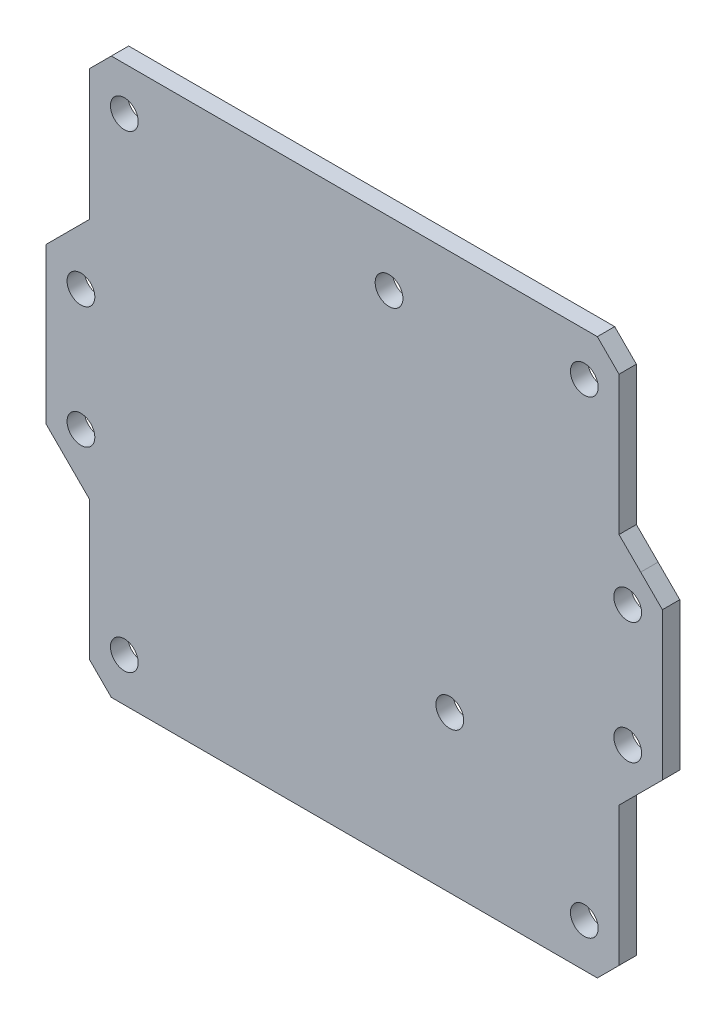
ISO-10303-21;
HEADER;
FILE_DESCRIPTION(('STEP AP214'),'2;1');
FILE_NAME('part.step','',(''),(''),'','','');
FILE_SCHEMA(('AUTOMOTIVE_DESIGN { 1 0 10303 214 1 1 1 1 }'));
ENDSEC;
DATA;
#1=APPLICATION_CONTEXT('core data for automotive mechanical design processes');
#2=APPLICATION_PROTOCOL_DEFINITION('international standard','automotive_design',2000,#1);
#3=PRODUCT_CONTEXT('',#1,'mechanical');
#4=PRODUCT('Part','Part','',(#3));
#5=PRODUCT_RELATED_PRODUCT_CATEGORY('part','',(#4));
#6=PRODUCT_DEFINITION_FORMATION('','',#4);
#7=PRODUCT_DEFINITION_CONTEXT('part definition',#1,'design');
#8=PRODUCT_DEFINITION('design','',#6,#7);
#9=PRODUCT_DEFINITION_SHAPE('','',#8);
#10=(LENGTH_UNIT() NAMED_UNIT(*) SI_UNIT(.MILLI.,.METRE.));
#11=(NAMED_UNIT(*) PLANE_ANGLE_UNIT() SI_UNIT($,.RADIAN.));
#12=(NAMED_UNIT(*) SI_UNIT($,.STERADIAN.) SOLID_ANGLE_UNIT());
#13=UNCERTAINTY_MEASURE_WITH_UNIT(LENGTH_MEASURE(1.E-05),#10,'distance_accuracy_value','');
#14=(GEOMETRIC_REPRESENTATION_CONTEXT(3) GLOBAL_UNCERTAINTY_ASSIGNED_CONTEXT((#13)) GLOBAL_UNIT_ASSIGNED_CONTEXT((#10,
#11,#12)) REPRESENTATION_CONTEXT('',''));
#15=CARTESIAN_POINT('',(0.,0.,0.));
#16=DIRECTION('',(0.,0.,1.));
#17=DIRECTION('',(1.,0.,0.));
#18=AXIS2_PLACEMENT_3D('',#15,#16,#17);
#19=CARTESIAN_POINT('',(0.,0.,2.));
#20=DIRECTION('',(0.,0.,1.));
#21=DIRECTION('',(1.,0.,0.));
#22=AXIS2_PLACEMENT_3D('',#19,#20,#21);
#23=PLANE('',#22);
#24=CARTESIAN_POINT('',(0.,0.,2.));
#25=DIRECTION('',(0.,0.,1.));
#26=DIRECTION('',(1.,0.,0.));
#27=AXIS2_PLACEMENT_3D('',#24,#25,#26);
#28=CIRCLE('',#27,1.6);
#29=CARTESIAN_POINT('',(1.6,0.,2.));
#30=VERTEX_POINT('',#29);
#31=EDGE_CURVE('E252',#30,#30,#28,.T.);
#32=ORIENTED_EDGE('',*,*,#31,.F.);
#33=EDGE_LOOP('',(#32));
#34=FACE_BOUND('',#33,.T.);
#35=CARTESIAN_POINT('',(-7.00000000000001,38.6,2.));
#36=DIRECTION('',(0.,0.,1.));
#37=DIRECTION('',(1.,0.,0.));
#38=AXIS2_PLACEMENT_3D('',#35,#36,#37);
#39=CIRCLE('',#38,1.6);
#40=CARTESIAN_POINT('',(-5.40000000000001,38.6,2.));
#41=VERTEX_POINT('',#40);
#42=EDGE_CURVE('E242',#41,#41,#39,.T.);
#43=ORIENTED_EDGE('',*,*,#42,.F.);
#44=EDGE_LOOP('',(#43));
#45=FACE_BOUND('',#44,.T.);
#46=CARTESIAN_POINT('',(20.5,21.,2.));
#47=DIRECTION('',(0.,0.,1.));
#48=DIRECTION('',(1.,0.,0.));
#49=AXIS2_PLACEMENT_3D('',#46,#47,#48);
#50=CIRCLE('',#49,1.6);
#51=CARTESIAN_POINT('',(22.1,21.,2.));
#52=VERTEX_POINT('',#51);
#53=EDGE_CURVE('E845',#52,#52,#50,.T.);
#54=ORIENTED_EDGE('',*,*,#53,.F.);
#55=EDGE_LOOP('',(#54));
#56=FACE_BOUND('',#55,.T.);
#57=CARTESIAN_POINT('',(20.5,7.,2.));
#58=DIRECTION('',(0.,0.,1.));
#59=DIRECTION('',(1.,0.,0.));
#60=AXIS2_PLACEMENT_3D('',#57,#58,#59);
#61=CIRCLE('',#60,1.6);
#62=CARTESIAN_POINT('',(22.1,7.,2.));
#63=VERTEX_POINT('',#62);
#64=EDGE_CURVE('E833',#63,#63,#61,.T.);
#65=ORIENTED_EDGE('',*,*,#64,.F.);
#66=EDGE_LOOP('',(#65));
#67=FACE_BOUND('',#66,.T.);
#68=CARTESIAN_POINT('',(15.5,41.,2.));
#69=DIRECTION('',(0.,0.,1.));
#70=DIRECTION('',(1.,0.,0.));
#71=AXIS2_PLACEMENT_3D('',#68,#69,#70);
#72=CIRCLE('',#71,1.6);
#73=CARTESIAN_POINT('',(17.1,41.,2.));
#74=VERTEX_POINT('',#73);
#75=EDGE_CURVE('E821',#74,#74,#72,.T.);
#76=ORIENTED_EDGE('',*,*,#75,.F.);
#77=EDGE_LOOP('',(#76));
#78=FACE_BOUND('',#77,.T.);
#79=CARTESIAN_POINT('',(15.5,-13.,2.));
#80=DIRECTION('',(0.,0.,1.));
#81=DIRECTION('',(1.,0.,0.));
#82=AXIS2_PLACEMENT_3D('',#79,#80,#81);
#83=CIRCLE('',#82,1.6);
#84=CARTESIAN_POINT('',(17.1,-13.,2.));
#85=VERTEX_POINT('',#84);
#86=EDGE_CURVE('E808',#85,#85,#83,.T.);
#87=ORIENTED_EDGE('',*,*,#86,.F.);
#88=EDGE_LOOP('',(#87));
#89=FACE_BOUND('',#88,.T.);
#90=DIRECTION('',(1.,0.,0.));
#91=VECTOR('',#90,1.);
#92=CARTESIAN_POINT('',(19.5,-18.,2.));
#93=LINE('',#92,#91);
#94=CARTESIAN_POINT('',(-39.,-18.,2.));
#95=VERTEX_POINT('',#94);
#96=CARTESIAN_POINT('',(17.,-18.,2.));
#97=VERTEX_POINT('',#96);
#98=EDGE_CURVE('E405',#95,#97,#93,.T.);
#99=ORIENTED_EDGE('',*,*,#98,.T.);
#100=DIRECTION('',(-0.707106781186548,-0.707106781186548,0.));
#101=VECTOR('',#100,1.);
#102=CARTESIAN_POINT('',(17.5,-17.5,2.));
#103=LINE('',#102,#101);
#104=CARTESIAN_POINT('',(19.5,-15.5,2.));
#105=VERTEX_POINT('',#104);
#106=EDGE_CURVE('E305',#97,#105,#103,.F.);
#107=ORIENTED_EDGE('',*,*,#106,.T.);
#108=DIRECTION('',(0.,1.,0.));
#109=VECTOR('',#108,1.);
#110=CARTESIAN_POINT('',(19.5,3.,2.));
#111=LINE('',#110,#109);
#112=CARTESIAN_POINT('',(19.5,0.500000000000004,2.));
#113=VERTEX_POINT('',#112);
#114=EDGE_CURVE('E209',#105,#113,#111,.T.);
#115=ORIENTED_EDGE('',*,*,#114,.T.);
#116=DIRECTION('',(-0.707106781186547,-0.707106781186548,0.));
#117=VECTOR('',#116,1.);
#118=CARTESIAN_POINT('',(22.,3.,2.));
#119=LINE('',#118,#117);
#120=CARTESIAN_POINT('',(22.,3.,2.));
#121=VERTEX_POINT('',#120);
#122=EDGE_CURVE('E350',#113,#121,#119,.F.);
#123=ORIENTED_EDGE('',*,*,#122,.T.);
#124=DIRECTION('',(-0.707106781186547,-0.707106781186548,0.));
#125=VECTOR('',#124,1.);
#126=CARTESIAN_POINT('',(9.50000000000001,-9.5,2.));
#127=LINE('',#126,#125);
#128=CARTESIAN_POINT('',(24.5,5.50000000000001,2.));
#129=VERTEX_POINT('',#128);
#130=EDGE_CURVE('E302',#121,#129,#127,.F.);
#131=ORIENTED_EDGE('',*,*,#130,.T.);
#132=DIRECTION('',(0.,1.,0.));
#133=VECTOR('',#132,1.);
#134=CARTESIAN_POINT('',(24.5,25.,2.));
#135=LINE('',#134,#133);
#136=CARTESIAN_POINT('',(24.5,22.5,2.));
#137=VERTEX_POINT('',#136);
#138=EDGE_CURVE('E415',#129,#137,#135,.T.);
#139=ORIENTED_EDGE('',*,*,#138,.T.);
#140=DIRECTION('',(0.707106781186548,-0.707106781186548,0.));
#141=VECTOR('',#140,1.);
#142=CARTESIAN_POINT('',(23.5,23.5,2.));
#143=LINE('',#142,#141);
#144=CARTESIAN_POINT('',(22.,25.,2.));
#145=VERTEX_POINT('',#144);
#146=EDGE_CURVE('E299',#137,#145,#143,.F.);
#147=ORIENTED_EDGE('',*,*,#146,.T.);
#148=DIRECTION('',(0.707106781186548,-0.707106781186548,0.));
#149=VECTOR('',#148,1.);
#150=CARTESIAN_POINT('',(19.5,27.5,2.));
#151=LINE('',#150,#149);
#152=CARTESIAN_POINT('',(19.5,27.5,2.));
#153=VERTEX_POINT('',#152);
#154=EDGE_CURVE('E356',#145,#153,#151,.F.);
#155=ORIENTED_EDGE('',*,*,#154,.T.);
#156=DIRECTION('',(0.,1.,0.));
#157=VECTOR('',#156,1.);
#158=CARTESIAN_POINT('',(19.5,46.,2.));
#159=LINE('',#158,#157);
#160=CARTESIAN_POINT('',(19.5,43.5,2.));
#161=VERTEX_POINT('',#160);
#162=EDGE_CURVE('E419',#153,#161,#159,.T.);
#163=ORIENTED_EDGE('',*,*,#162,.T.);
#164=DIRECTION('',(0.707106781186547,-0.707106781186549,0.));
#165=VECTOR('',#164,1.);
#166=CARTESIAN_POINT('',(31.5,31.4999999999999,2.));
#167=LINE('',#166,#165);
#168=CARTESIAN_POINT('',(17.,46.,2.));
#169=VERTEX_POINT('',#168);
#170=EDGE_CURVE('E296',#161,#169,#167,.F.);
#171=ORIENTED_EDGE('',*,*,#170,.T.);
#172=DIRECTION('',(-1.,0.,0.));
#173=VECTOR('',#172,1.);
#174=CARTESIAN_POINT('',(-33.8800351925215,46.,2.));
#175=LINE('',#174,#173);
#176=CARTESIAN_POINT('',(-39.,46.,2.));
#177=VERTEX_POINT('',#176);
#178=EDGE_CURVE('E423',#169,#177,#175,.T.);
#179=ORIENTED_EDGE('',*,*,#178,.T.);
#180=DIRECTION('',(0.707106781186548,0.707106781186548,0.));
#181=VECTOR('',#180,1.);
#182=CARTESIAN_POINT('',(-42.5,42.5,2.));
#183=LINE('',#182,#181);
#184=CARTESIAN_POINT('',(-41.5,43.5,2.));
#185=VERTEX_POINT('',#184);
#186=EDGE_CURVE('E70',#177,#185,#183,.F.);
#187=ORIENTED_EDGE('',*,*,#186,.T.);
#188=DIRECTION('',(0.,-1.,0.));
#189=VECTOR('',#188,1.);
#190=CARTESIAN_POINT('',(-41.5,46.,2.));
#191=LINE('',#190,#189);
#192=CARTESIAN_POINT('',(-41.5,28.4600726554993,2.));
#193=VERTEX_POINT('',#192);
#194=EDGE_CURVE('E251',#185,#193,#191,.T.);
#195=ORIENTED_EDGE('',*,*,#194,.T.);
#196=DIRECTION('',(0.707106781186548,0.707106781186547,0.));
#197=VECTOR('',#196,1.);
#198=CARTESIAN_POINT('',(-44.,25.9600726554993,2.));
#199=LINE('',#198,#197);
#200=CARTESIAN_POINT('',(-44.,25.9600726554993,2.));
#201=VERTEX_POINT('',#200);
#202=EDGE_CURVE('E13',#193,#201,#199,.F.);
#203=ORIENTED_EDGE('',*,*,#202,.T.);
#204=DIRECTION('',(0.707106781186548,0.707106781186547,0.));
#205=VECTOR('',#204,1.);
#206=CARTESIAN_POINT('',(-34.9800363277496,34.9800363277496,2.));
#207=LINE('',#206,#205);
#208=CARTESIAN_POINT('',(-46.5,23.4600726554993,2.));
#209=VERTEX_POINT('',#208);
#210=EDGE_CURVE('E287',#201,#209,#207,.F.);
#211=ORIENTED_EDGE('',*,*,#210,.T.);
#212=DIRECTION('',(0.,-1.,0.));
#213=VECTOR('',#212,1.);
#214=CARTESIAN_POINT('',(-46.5,25.9600726554993,2.));
#215=LINE('',#214,#213);
#216=CARTESIAN_POINT('',(-46.5,5.50000000000001,2.));
#217=VERTEX_POINT('',#216);
#218=EDGE_CURVE('E241',#209,#217,#215,.T.);
#219=ORIENTED_EDGE('',*,*,#218,.T.);
#220=DIRECTION('',(-0.707106781186548,0.707106781186548,0.));
#221=VECTOR('',#220,1.);
#222=CARTESIAN_POINT('',(-20.5,-20.5,2.));
#223=LINE('',#222,#221);
#224=CARTESIAN_POINT('',(-44.,3.,2.));
#225=VERTEX_POINT('',#224);
#226=EDGE_CURVE('E290',#217,#225,#223,.F.);
#227=ORIENTED_EDGE('',*,*,#226,.T.);
#228=DIRECTION('',(-0.707106781186548,0.707106781186547,0.));
#229=VECTOR('',#228,1.);
#230=CARTESIAN_POINT('',(-41.5,0.500000000000004,2.));
#231=LINE('',#230,#229);
#232=CARTESIAN_POINT('',(-41.5,0.500000000000005,2.));
#233=VERTEX_POINT('',#232);
#234=EDGE_CURVE('E362',#225,#233,#231,.F.);
#235=ORIENTED_EDGE('',*,*,#234,.T.);
#236=DIRECTION('',(0.,-1.,0.));
#237=VECTOR('',#236,1.);
#238=CARTESIAN_POINT('',(-41.5,3.,2.));
#239=LINE('',#238,#237);
#240=CARTESIAN_POINT('',(-41.5,-15.5,2.));
#241=VERTEX_POINT('',#240);
#242=EDGE_CURVE('E401',#233,#241,#239,.T.);
#243=ORIENTED_EDGE('',*,*,#242,.T.);
#244=DIRECTION('',(-0.707106781186548,0.707106781186547,0.));
#245=VECTOR('',#244,1.);
#246=CARTESIAN_POINT('',(-28.5,-28.5,2.));
#247=LINE('',#246,#245);
#248=EDGE_CURVE('E293',#241,#95,#247,.F.);
#249=ORIENTED_EDGE('',*,*,#248,.T.);
#250=EDGE_LOOP('',(#99,#107,#115,#123,#131,#139,#147,#155,#163,#171,#179,#187,#195,#203,#211,
#219,#227,#235,#243,#249));
#251=FACE_BOUND('',#250,.T.);
#252=CARTESIAN_POINT('',(-37.5,41.,2.));
#253=DIRECTION('',(0.,0.,1.));
#254=DIRECTION('',(1.,0.,0.));
#255=AXIS2_PLACEMENT_3D('',#252,#253,#254);
#256=CIRCLE('',#255,1.6);
#257=CARTESIAN_POINT('',(-35.9,41.,2.));
#258=VERTEX_POINT('',#257);
#259=EDGE_CURVE('E430',#258,#258,#256,.T.);
#260=ORIENTED_EDGE('',*,*,#259,.F.);
#261=EDGE_LOOP('',(#260));
#262=FACE_BOUND('',#261,.T.);
#263=CARTESIAN_POINT('',(-37.5,-13.,2.));
#264=DIRECTION('',(0.,0.,1.));
#265=DIRECTION('',(1.,0.,0.));
#266=AXIS2_PLACEMENT_3D('',#263,#264,#265);
#267=CIRCLE('',#266,1.6);
#268=CARTESIAN_POINT('',(-35.9,-13.,2.));
#269=VERTEX_POINT('',#268);
#270=EDGE_CURVE('E816',#269,#269,#267,.T.);
#271=ORIENTED_EDGE('',*,*,#270,.F.);
#272=EDGE_LOOP('',(#271));
#273=FACE_BOUND('',#272,.T.);
#274=CARTESIAN_POINT('',(-42.5,21.,2.));
#275=DIRECTION('',(0.,0.,1.));
#276=DIRECTION('',(1.,0.,0.));
#277=AXIS2_PLACEMENT_3D('',#274,#275,#276);
#278=CIRCLE('',#277,1.6);
#279=CARTESIAN_POINT('',(-40.9,21.,2.));
#280=VERTEX_POINT('',#279);
#281=EDGE_CURVE('E827',#280,#280,#278,.T.);
#282=ORIENTED_EDGE('',*,*,#281,.F.);
#283=EDGE_LOOP('',(#282));
#284=FACE_BOUND('',#283,.T.);
#285=CARTESIAN_POINT('',(-42.5,7.,2.));
#286=DIRECTION('',(0.,0.,1.));
#287=DIRECTION('',(1.,0.,0.));
#288=AXIS2_PLACEMENT_3D('',#285,#286,#287);
#289=CIRCLE('',#288,1.6);
#290=CARTESIAN_POINT('',(-40.9,7.,2.));
#291=VERTEX_POINT('',#290);
#292=EDGE_CURVE('E839',#291,#291,#289,.T.);
#293=ORIENTED_EDGE('',*,*,#292,.F.);
#294=EDGE_LOOP('',(#293));
#295=FACE_BOUND('',#294,.T.);
#296=ADVANCED_FACE('F45',(#34,#45,#56,#67,#78,#89,#251,#262,#273,#284,#295),#23,.T.);
#297=CARTESIAN_POINT('',(0.,0.,0.));
#298=DIRECTION('',(0.,0.,1.));
#299=DIRECTION('',(1.,0.,0.));
#300=AXIS2_PLACEMENT_3D('',#297,#298,#299);
#301=PLANE('',#300);
#302=CARTESIAN_POINT('',(0.,0.,0.));
#303=DIRECTION('',(0.,0.,1.));
#304=DIRECTION('',(1.,0.,0.));
#305=AXIS2_PLACEMENT_3D('',#302,#303,#304);
#306=CIRCLE('',#305,1.6);
#307=CARTESIAN_POINT('',(1.6,0.,0.));
#308=VERTEX_POINT('',#307);
#309=EDGE_CURVE('E246',#308,#308,#306,.T.);
#310=ORIENTED_EDGE('',*,*,#309,.T.);
#311=EDGE_LOOP('',(#310));
#312=FACE_BOUND('',#311,.T.);
#313=CARTESIAN_POINT('',(-7.00000000000001,38.6,0.));
#314=DIRECTION('',(0.,0.,1.));
#315=DIRECTION('',(1.,0.,0.));
#316=AXIS2_PLACEMENT_3D('',#313,#314,#315);
#317=CIRCLE('',#316,1.6);
#318=CARTESIAN_POINT('',(-5.40000000000001,38.6,0.));
#319=VERTEX_POINT('',#318);
#320=EDGE_CURVE('E247',#319,#319,#317,.T.);
#321=ORIENTED_EDGE('',*,*,#320,.T.);
#322=EDGE_LOOP('',(#321));
#323=FACE_BOUND('',#322,.T.);
#324=CARTESIAN_POINT('',(20.5,21.,0.));
#325=DIRECTION('',(0.,0.,1.));
#326=DIRECTION('',(1.,0.,0.));
#327=AXIS2_PLACEMENT_3D('',#324,#325,#326);
#328=CIRCLE('',#327,1.6);
#329=CARTESIAN_POINT('',(22.1,21.,0.));
#330=VERTEX_POINT('',#329);
#331=EDGE_CURVE('E371',#330,#330,#328,.T.);
#332=ORIENTED_EDGE('',*,*,#331,.T.);
#333=EDGE_LOOP('',(#332));
#334=FACE_BOUND('',#333,.T.);
#335=CARTESIAN_POINT('',(-42.5,7.,0.));
#336=DIRECTION('',(0.,0.,1.));
#337=DIRECTION('',(1.,0.,0.));
#338=AXIS2_PLACEMENT_3D('',#335,#336,#337);
#339=CIRCLE('',#338,1.6);
#340=CARTESIAN_POINT('',(-40.9,7.,0.));
#341=VERTEX_POINT('',#340);
#342=EDGE_CURVE('E783',#341,#341,#339,.T.);
#343=ORIENTED_EDGE('',*,*,#342,.T.);
#344=EDGE_LOOP('',(#343));
#345=FACE_BOUND('',#344,.T.);
#346=CARTESIAN_POINT('',(20.5,7.,0.));
#347=DIRECTION('',(0.,0.,1.));
#348=DIRECTION('',(1.,0.,0.));
#349=AXIS2_PLACEMENT_3D('',#346,#347,#348);
#350=CIRCLE('',#349,1.6);
#351=CARTESIAN_POINT('',(22.1,7.,0.));
#352=VERTEX_POINT('',#351);
#353=EDGE_CURVE('E787',#352,#352,#350,.T.);
#354=ORIENTED_EDGE('',*,*,#353,.T.);
#355=EDGE_LOOP('',(#354));
#356=FACE_BOUND('',#355,.T.);
#357=CARTESIAN_POINT('',(-42.5,21.,0.));
#358=DIRECTION('',(0.,0.,1.));
#359=DIRECTION('',(1.,0.,0.));
#360=AXIS2_PLACEMENT_3D('',#357,#358,#359);
#361=CIRCLE('',#360,1.6);
#362=CARTESIAN_POINT('',(-40.9,21.,0.));
#363=VERTEX_POINT('',#362);
#364=EDGE_CURVE('E791',#363,#363,#361,.T.);
#365=ORIENTED_EDGE('',*,*,#364,.T.);
#366=EDGE_LOOP('',(#365));
#367=FACE_BOUND('',#366,.T.);
#368=CARTESIAN_POINT('',(15.5,41.,0.));
#369=DIRECTION('',(0.,0.,1.));
#370=DIRECTION('',(1.,0.,0.));
#371=AXIS2_PLACEMENT_3D('',#368,#369,#370);
#372=CIRCLE('',#371,1.6);
#373=CARTESIAN_POINT('',(17.1,41.,0.));
#374=VERTEX_POINT('',#373);
#375=EDGE_CURVE('E795',#374,#374,#372,.T.);
#376=ORIENTED_EDGE('',*,*,#375,.T.);
#377=EDGE_LOOP('',(#376));
#378=FACE_BOUND('',#377,.T.);
#379=CARTESIAN_POINT('',(-37.5,-13.,0.));
#380=DIRECTION('',(0.,0.,1.));
#381=DIRECTION('',(1.,0.,0.));
#382=AXIS2_PLACEMENT_3D('',#379,#380,#381);
#383=CIRCLE('',#382,1.6);
#384=CARTESIAN_POINT('',(-35.9,-13.,0.));
#385=VERTEX_POINT('',#384);
#386=EDGE_CURVE('E799',#385,#385,#383,.T.);
#387=ORIENTED_EDGE('',*,*,#386,.T.);
#388=EDGE_LOOP('',(#387));
#389=FACE_BOUND('',#388,.T.);
#390=CARTESIAN_POINT('',(15.5,-13.,0.));
#391=DIRECTION('',(0.,0.,1.));
#392=DIRECTION('',(1.,0.,0.));
#393=AXIS2_PLACEMENT_3D('',#390,#391,#392);
#394=CIRCLE('',#393,1.6);
#395=CARTESIAN_POINT('',(17.1,-13.,0.));
#396=VERTEX_POINT('',#395);
#397=EDGE_CURVE('E803',#396,#396,#394,.T.);
#398=ORIENTED_EDGE('',*,*,#397,.T.);
#399=EDGE_LOOP('',(#398));
#400=FACE_BOUND('',#399,.T.);
#401=CARTESIAN_POINT('',(-37.5,41.,0.));
#402=DIRECTION('',(0.,0.,1.));
#403=DIRECTION('',(1.,0.,0.));
#404=AXIS2_PLACEMENT_3D('',#401,#402,#403);
#405=CIRCLE('',#404,1.6);
#406=CARTESIAN_POINT('',(-35.9,41.,0.));
#407=VERTEX_POINT('',#406);
#408=EDGE_CURVE('E408',#407,#407,#405,.T.);
#409=ORIENTED_EDGE('',*,*,#408,.T.);
#410=EDGE_LOOP('',(#409));
#411=FACE_BOUND('',#410,.T.);
#412=DIRECTION('',(0.,1.,0.));
#413=VECTOR('',#412,1.);
#414=CARTESIAN_POINT('',(19.5,3.,0.));
#415=LINE('',#414,#413);
#416=CARTESIAN_POINT('',(19.5,-15.5,0.));
#417=VERTEX_POINT('',#416);
#418=CARTESIAN_POINT('',(19.5,0.500000000000004,0.));
#419=VERTEX_POINT('',#418);
#420=EDGE_CURVE('E206',#417,#419,#415,.T.);
#421=ORIENTED_EDGE('',*,*,#420,.F.);
#422=DIRECTION('',(0.707106781186548,0.707106781186548,0.));
#423=VECTOR('',#422,1.);
#424=CARTESIAN_POINT('',(19.5,-15.5,0.));
#425=LINE('',#424,#423);
#426=CARTESIAN_POINT('',(17.,-18.,0.));
#427=VERTEX_POINT('',#426);
#428=EDGE_CURVE('E187',#417,#427,#425,.F.);
#429=ORIENTED_EDGE('',*,*,#428,.T.);
#430=DIRECTION('',(1.,0.,0.));
#431=VECTOR('',#430,1.);
#432=CARTESIAN_POINT('',(19.5,-18.,0.));
#433=LINE('',#432,#431);
#434=CARTESIAN_POINT('',(-39.,-18.,0.));
#435=VERTEX_POINT('',#434);
#436=EDGE_CURVE('E219',#435,#427,#433,.T.);
#437=ORIENTED_EDGE('',*,*,#436,.F.);
#438=DIRECTION('',(0.707106781186548,-0.707106781186547,0.));
#439=VECTOR('',#438,1.);
#440=CARTESIAN_POINT('',(-39.,-18.,0.));
#441=LINE('',#440,#439);
#442=CARTESIAN_POINT('',(-41.5,-15.5,0.));
#443=VERTEX_POINT('',#442);
#444=EDGE_CURVE('E269',#435,#443,#441,.F.);
#445=ORIENTED_EDGE('',*,*,#444,.T.);
#446=DIRECTION('',(0.,-1.,0.));
#447=VECTOR('',#446,1.);
#448=CARTESIAN_POINT('',(-41.5,-18.,0.));
#449=LINE('',#448,#447);
#450=CARTESIAN_POINT('',(-41.5,0.500000000000004,0.));
#451=VERTEX_POINT('',#450);
#452=EDGE_CURVE('E226',#451,#443,#449,.T.);
#453=ORIENTED_EDGE('',*,*,#452,.F.);
#454=DIRECTION('',(0.707106781186548,-0.707106781186547,0.));
#455=VECTOR('',#454,1.);
#456=CARTESIAN_POINT('',(-20.5,-20.5,0.));
#457=LINE('',#456,#455);
#458=CARTESIAN_POINT('',(-44.,3.,0.));
#459=VERTEX_POINT('',#458);
#460=EDGE_CURVE('E359',#451,#459,#457,.F.);
#461=ORIENTED_EDGE('',*,*,#460,.T.);
#462=DIRECTION('',(0.707106781186548,-0.707106781186548,0.));
#463=VECTOR('',#462,1.);
#464=CARTESIAN_POINT('',(-44.,3.,0.));
#465=LINE('',#464,#463);
#466=CARTESIAN_POINT('',(-46.5,5.50000000000001,0.));
#467=VERTEX_POINT('',#466);
#468=EDGE_CURVE('E266',#459,#467,#465,.F.);
#469=ORIENTED_EDGE('',*,*,#468,.T.);
#470=DIRECTION('',(0.,-1.,0.));
#471=VECTOR('',#470,1.);
#472=CARTESIAN_POINT('',(-46.5,25.9600726554993,0.));
#473=LINE('',#472,#471);
#474=CARTESIAN_POINT('',(-46.5,23.4600726554993,0.));
#475=VERTEX_POINT('',#474);
#476=EDGE_CURVE('E428',#475,#467,#473,.T.);
#477=ORIENTED_EDGE('',*,*,#476,.F.);
#478=DIRECTION('',(-0.707106781186548,-0.707106781186547,0.));
#479=VECTOR('',#478,1.);
#480=CARTESIAN_POINT('',(-46.5,23.4600726554993,0.));
#481=LINE('',#480,#479);
#482=CARTESIAN_POINT('',(-44.,25.9600726554993,0.));
#483=VERTEX_POINT('',#482);
#484=EDGE_CURVE('E263',#475,#483,#481,.F.);
#485=ORIENTED_EDGE('',*,*,#484,.T.);
#486=DIRECTION('',(-0.707106781186548,-0.707106781186547,0.));
#487=VECTOR('',#486,1.);
#488=CARTESIAN_POINT('',(-34.9800363277496,34.9800363277497,0.));
#489=LINE('',#488,#487);
#490=CARTESIAN_POINT('',(-41.5,28.4600726554993,0.));
#491=VERTEX_POINT('',#490);
#492=EDGE_CURVE('E56',#483,#491,#489,.F.);
#493=ORIENTED_EDGE('',*,*,#492,.T.);
#494=DIRECTION('',(0.,-1.,0.));
#495=VECTOR('',#494,1.);
#496=CARTESIAN_POINT('',(-41.5,46.,0.));
#497=LINE('',#496,#495);
#498=CARTESIAN_POINT('',(-41.5,43.5,0.));
#499=VERTEX_POINT('',#498);
#500=EDGE_CURVE('E237',#499,#491,#497,.T.);
#501=ORIENTED_EDGE('',*,*,#500,.F.);
#502=DIRECTION('',(-0.707106781186548,-0.707106781186548,0.));
#503=VECTOR('',#502,1.);
#504=CARTESIAN_POINT('',(-41.5,43.5,0.));
#505=LINE('',#504,#503);
#506=CARTESIAN_POINT('',(-39.,46.,0.));
#507=VERTEX_POINT('',#506);
#508=EDGE_CURVE('E211',#499,#507,#505,.F.);
#509=ORIENTED_EDGE('',*,*,#508,.T.);
#510=DIRECTION('',(-1.,0.,0.));
#511=VECTOR('',#510,1.);
#512=CARTESIAN_POINT('',(-33.8800351925215,46.,0.));
#513=LINE('',#512,#511);
#514=CARTESIAN_POINT('',(17.,46.,0.));
#515=VERTEX_POINT('',#514);
#516=EDGE_CURVE('E233',#515,#507,#513,.T.);
#517=ORIENTED_EDGE('',*,*,#516,.F.);
#518=DIRECTION('',(-0.707106781186547,0.707106781186549,0.));
#519=VECTOR('',#518,1.);
#520=CARTESIAN_POINT('',(17.,46.,0.));
#521=LINE('',#520,#519);
#522=CARTESIAN_POINT('',(19.5,43.5,0.));
#523=VERTEX_POINT('',#522);
#524=EDGE_CURVE('E272',#515,#523,#521,.F.);
#525=ORIENTED_EDGE('',*,*,#524,.T.);
#526=DIRECTION('',(0.,1.,0.));
#527=VECTOR('',#526,1.);
#528=CARTESIAN_POINT('',(19.5,46.,0.));
#529=LINE('',#528,#527);
#530=CARTESIAN_POINT('',(19.5,27.5,0.));
#531=VERTEX_POINT('',#530);
#532=EDGE_CURVE('E224',#531,#523,#529,.T.);
#533=ORIENTED_EDGE('',*,*,#532,.F.);
#534=DIRECTION('',(-0.707106781186548,0.707106781186548,0.));
#535=VECTOR('',#534,1.);
#536=CARTESIAN_POINT('',(23.5,23.5,0.));
#537=LINE('',#536,#535);
#538=CARTESIAN_POINT('',(22.,25.,0.));
#539=VERTEX_POINT('',#538);
#540=EDGE_CURVE('E353',#531,#539,#537,.F.);
#541=ORIENTED_EDGE('',*,*,#540,.T.);
#542=DIRECTION('',(-0.707106781186548,0.707106781186548,0.));
#543=VECTOR('',#542,1.);
#544=CARTESIAN_POINT('',(22.,25.,0.));
#545=LINE('',#544,#543);
#546=CARTESIAN_POINT('',(24.5,22.5,0.));
#547=VERTEX_POINT('',#546);
#548=EDGE_CURVE('E275',#539,#547,#545,.F.);
#549=ORIENTED_EDGE('',*,*,#548,.T.);
#550=DIRECTION('',(0.,1.,0.));
#551=VECTOR('',#550,1.);
#552=CARTESIAN_POINT('',(24.5,25.,0.));
#553=LINE('',#552,#551);
#554=CARTESIAN_POINT('',(24.5,5.50000000000001,0.));
#555=VERTEX_POINT('',#554);
#556=EDGE_CURVE('E218',#555,#547,#553,.T.);
#557=ORIENTED_EDGE('',*,*,#556,.F.);
#558=DIRECTION('',(0.707106781186547,0.707106781186548,0.));
#559=VECTOR('',#558,1.);
#560=CARTESIAN_POINT('',(24.5,5.50000000000001,0.));
#561=LINE('',#560,#559);
#562=CARTESIAN_POINT('',(22.,3.,0.));
#563=VERTEX_POINT('',#562);
#564=EDGE_CURVE('E199',#555,#563,#561,.F.);
#565=ORIENTED_EDGE('',*,*,#564,.T.);
#566=DIRECTION('',(0.707106781186547,0.707106781186548,0.));
#567=VECTOR('',#566,1.);
#568=CARTESIAN_POINT('',(9.5,-9.5,0.));
#569=LINE('',#568,#567);
#570=EDGE_CURVE('E216',#563,#419,#569,.F.);
#571=ORIENTED_EDGE('',*,*,#570,.T.);
#572=EDGE_LOOP('',(#421,#429,#437,#445,#453,#461,#469,#477,#485,#493,#501,#509,#517,#525,#533,
#541,#549,#557,#565,#571));
#573=FACE_BOUND('',#572,.T.);
#574=ADVANCED_FACE('F214',(#312,#323,#334,#345,#356,#367,#378,#389,#400,#411,#573),#301,.F.);
#575=CARTESIAN_POINT('',(0.,0.,2.));
#576=DIRECTION('',(0.,0.,-1.));
#577=DIRECTION('',(-1.,0.,0.));
#578=AXIS2_PLACEMENT_3D('',#575,#576,#577);
#579=CYLINDRICAL_SURFACE('',#578,1.6);
#580=ORIENTED_EDGE('',*,*,#31,.T.);
#581=EDGE_LOOP('',(#580));
#582=FACE_BOUND('',#581,.T.);
#583=ORIENTED_EDGE('',*,*,#309,.F.);
#584=EDGE_LOOP('',(#583));
#585=FACE_BOUND('',#584,.T.);
#586=ADVANCED_FACE('F461',(#582,#585),#579,.F.);
#587=CARTESIAN_POINT('',(-7.00000000000001,38.6,2.));
#588=DIRECTION('',(0.,0.,-1.));
#589=DIRECTION('',(-1.,0.,0.));
#590=AXIS2_PLACEMENT_3D('',#587,#588,#589);
#591=CYLINDRICAL_SURFACE('',#590,1.6);
#592=ORIENTED_EDGE('',*,*,#42,.T.);
#593=EDGE_LOOP('',(#592));
#594=FACE_BOUND('',#593,.T.);
#595=ORIENTED_EDGE('',*,*,#320,.F.);
#596=EDGE_LOOP('',(#595));
#597=FACE_BOUND('',#596,.T.);
#598=ADVANCED_FACE('F737',(#594,#597),#591,.F.);
#599=CARTESIAN_POINT('',(-46.5,25.9600726554993,2.));
#600=DIRECTION('',(1.,0.,0.));
#601=DIRECTION('',(0.,0.,-1.));
#602=AXIS2_PLACEMENT_3D('',#599,#600,#601);
#603=PLANE('',#602);
#604=ORIENTED_EDGE('',*,*,#476,.T.);
#605=DIRECTION('',(0.,0.,1.));
#606=VECTOR('',#605,1.);
#607=CARTESIAN_POINT('',(-46.5,5.50000000000001,2.));
#608=LINE('',#607,#606);
#609=EDGE_CURVE('E338',#467,#217,#608,.T.);
#610=ORIENTED_EDGE('',*,*,#609,.T.);
#611=ORIENTED_EDGE('',*,*,#218,.F.);
#612=DIRECTION('',(0.,0.,-1.));
#613=VECTOR('',#612,1.);
#614=CARTESIAN_POINT('',(-46.5,23.4600726554993,2.));
#615=LINE('',#614,#613);
#616=EDGE_CURVE('E335',#209,#475,#615,.T.);
#617=ORIENTED_EDGE('',*,*,#616,.T.);
#618=EDGE_LOOP('',(#604,#610,#611,#617));
#619=FACE_BOUND('',#618,.T.);
#620=ADVANCED_FACE('F397',(#619),#603,.F.);
#621=CARTESIAN_POINT('',(-41.5,-18.,2.));
#622=DIRECTION('',(1.,0.,0.));
#623=DIRECTION('',(0.,0.,-1.));
#624=AXIS2_PLACEMENT_3D('',#621,#622,#623);
#625=PLANE('',#624);
#626=ORIENTED_EDGE('',*,*,#452,.T.);
#627=DIRECTION('',(0.,0.,1.));
#628=VECTOR('',#627,1.);
#629=CARTESIAN_POINT('',(-41.5,-15.5,2.));
#630=LINE('',#629,#628);
#631=EDGE_CURVE('E332',#443,#241,#630,.T.);
#632=ORIENTED_EDGE('',*,*,#631,.T.);
#633=ORIENTED_EDGE('',*,*,#242,.F.);
#634=DIRECTION('',(0.,0.,-1.));
#635=VECTOR('',#634,1.);
#636=CARTESIAN_POINT('',(-41.5,0.500000000000004,0.));
#637=LINE('',#636,#635);
#638=EDGE_CURVE('E328',#233,#451,#637,.T.);
#639=ORIENTED_EDGE('',*,*,#638,.T.);
#640=EDGE_LOOP('',(#626,#632,#633,#639));
#641=FACE_BOUND('',#640,.T.);
#642=ADVANCED_FACE('F436',(#641),#625,.F.);
#643=CARTESIAN_POINT('',(19.5,-18.,2.));
#644=DIRECTION('',(0.,1.,0.));
#645=DIRECTION('',(-1.,0.,0.));
#646=AXIS2_PLACEMENT_3D('',#643,#644,#645);
#647=PLANE('',#646);
#648=ORIENTED_EDGE('',*,*,#436,.T.);
#649=DIRECTION('',(0.,0.,1.));
#650=VECTOR('',#649,1.);
#651=CARTESIAN_POINT('',(17.,-18.,2.));
#652=LINE('',#651,#650);
#653=EDGE_CURVE('E192',#427,#97,#652,.T.);
#654=ORIENTED_EDGE('',*,*,#653,.T.);
#655=ORIENTED_EDGE('',*,*,#98,.F.);
#656=DIRECTION('',(0.,0.,-1.));
#657=VECTOR('',#656,1.);
#658=CARTESIAN_POINT('',(-39.,-18.,2.));
#659=LINE('',#658,#657);
#660=EDGE_CURVE('E198',#95,#435,#659,.T.);
#661=ORIENTED_EDGE('',*,*,#660,.T.);
#662=EDGE_LOOP('',(#648,#654,#655,#661));
#663=FACE_BOUND('',#662,.T.);
#664=ADVANCED_FACE('F445',(#663),#647,.F.);
#665=CARTESIAN_POINT('',(19.5,3.,2.));
#666=DIRECTION('',(-1.,0.,0.));
#667=DIRECTION('',(0.,-1.,0.));
#668=AXIS2_PLACEMENT_3D('',#665,#666,#667);
#669=PLANE('',#668);
#670=ORIENTED_EDGE('',*,*,#114,.F.);
#671=DIRECTION('',(0.,0.,-1.));
#672=VECTOR('',#671,1.);
#673=CARTESIAN_POINT('',(19.5,-15.5,2.));
#674=LINE('',#673,#672);
#675=EDGE_CURVE('E191',#105,#417,#674,.T.);
#676=ORIENTED_EDGE('',*,*,#675,.T.);
#677=ORIENTED_EDGE('',*,*,#420,.T.);
#678=DIRECTION('',(0.,0.,1.));
#679=VECTOR('',#678,1.);
#680=CARTESIAN_POINT('',(19.5,0.500000000000004,2.));
#681=LINE('',#680,#679);
#682=EDGE_CURVE('E212',#419,#113,#681,.T.);
#683=ORIENTED_EDGE('',*,*,#682,.T.);
#684=EDGE_LOOP('',(#670,#676,#677,#683));
#685=FACE_BOUND('',#684,.T.);
#686=ADVANCED_FACE('F204',(#685),#669,.F.);
#687=CARTESIAN_POINT('',(24.5,25.,2.));
#688=DIRECTION('',(-1.,0.,0.));
#689=DIRECTION('',(0.,-1.,0.));
#690=AXIS2_PLACEMENT_3D('',#687,#688,#689);
#691=PLANE('',#690);
#692=ORIENTED_EDGE('',*,*,#138,.F.);
#693=DIRECTION('',(0.,0.,-1.));
#694=VECTOR('',#693,1.);
#695=CARTESIAN_POINT('',(24.5,5.50000000000001,2.));
#696=LINE('',#695,#694);
#697=EDGE_CURVE('E312',#129,#555,#696,.T.);
#698=ORIENTED_EDGE('',*,*,#697,.T.);
#699=ORIENTED_EDGE('',*,*,#556,.T.);
#700=DIRECTION('',(0.,0.,1.));
#701=VECTOR('',#700,1.);
#702=CARTESIAN_POINT('',(24.5,22.5,2.));
#703=LINE('',#702,#701);
#704=EDGE_CURVE('E308',#547,#137,#703,.T.);
#705=ORIENTED_EDGE('',*,*,#704,.T.);
#706=EDGE_LOOP('',(#692,#698,#699,#705));
#707=FACE_BOUND('',#706,.T.);
#708=ADVANCED_FACE('F452',(#707),#691,.F.);
#709=CARTESIAN_POINT('',(19.5,46.,2.));
#710=DIRECTION('',(-1.,0.,0.));
#711=DIRECTION('',(0.,-1.,0.));
#712=AXIS2_PLACEMENT_3D('',#709,#710,#711);
#713=PLANE('',#712);
#714=ORIENTED_EDGE('',*,*,#162,.F.);
#715=DIRECTION('',(0.,0.,-1.));
#716=VECTOR('',#715,1.);
#717=CARTESIAN_POINT('',(19.5,27.5,0.));
#718=LINE('',#717,#716);
#719=EDGE_CURVE('E318',#153,#531,#718,.T.);
#720=ORIENTED_EDGE('',*,*,#719,.T.);
#721=ORIENTED_EDGE('',*,*,#532,.T.);
#722=DIRECTION('',(0.,0.,1.));
#723=VECTOR('',#722,1.);
#724=CARTESIAN_POINT('',(19.5,43.5,2.));
#725=LINE('',#724,#723);
#726=EDGE_CURVE('E315',#523,#161,#725,.T.);
#727=ORIENTED_EDGE('',*,*,#726,.T.);
#728=EDGE_LOOP('',(#714,#720,#721,#727));
#729=FACE_BOUND('',#728,.T.);
#730=ADVANCED_FACE('F690',(#729),#713,.F.);
#731=CARTESIAN_POINT('',(-33.8800351925215,46.,2.));
#732=DIRECTION('',(0.,-1.,0.));
#733=DIRECTION('',(0.,0.,-1.));
#734=AXIS2_PLACEMENT_3D('',#731,#732,#733);
#735=PLANE('',#734);
#736=ORIENTED_EDGE('',*,*,#178,.F.);
#737=DIRECTION('',(0.,0.,-1.));
#738=VECTOR('',#737,1.);
#739=CARTESIAN_POINT('',(17.,46.,2.));
#740=LINE('',#739,#738);
#741=EDGE_CURVE('E324',#169,#515,#740,.T.);
#742=ORIENTED_EDGE('',*,*,#741,.T.);
#743=ORIENTED_EDGE('',*,*,#516,.T.);
#744=DIRECTION('',(0.,0.,1.));
#745=VECTOR('',#744,1.);
#746=CARTESIAN_POINT('',(-39.,46.,2.));
#747=LINE('',#746,#745);
#748=EDGE_CURVE('E321',#507,#177,#747,.T.);
#749=ORIENTED_EDGE('',*,*,#748,.T.);
#750=EDGE_LOOP('',(#736,#742,#743,#749));
#751=FACE_BOUND('',#750,.T.);
#752=ADVANCED_FACE('F681',(#751),#735,.F.);
#753=CARTESIAN_POINT('',(-41.5,46.,2.));
#754=DIRECTION('',(1.,0.,0.));
#755=DIRECTION('',(0.,1.,0.));
#756=AXIS2_PLACEMENT_3D('',#753,#754,#755);
#757=PLANE('',#756);
#758=ORIENTED_EDGE('',*,*,#500,.T.);
#759=DIRECTION('',(0.,0.,1.));
#760=VECTOR('',#759,1.);
#761=CARTESIAN_POINT('',(-41.5,28.4600726554993,2.));
#762=LINE('',#761,#760);
#763=EDGE_CURVE('E345',#491,#193,#762,.T.);
#764=ORIENTED_EDGE('',*,*,#763,.T.);
#765=ORIENTED_EDGE('',*,*,#194,.F.);
#766=DIRECTION('',(0.,0.,-1.));
#767=VECTOR('',#766,1.);
#768=CARTESIAN_POINT('',(-41.5,43.5,2.));
#769=LINE('',#768,#767);
#770=EDGE_CURVE('E341',#185,#499,#769,.T.);
#771=ORIENTED_EDGE('',*,*,#770,.T.);
#772=EDGE_LOOP('',(#758,#764,#765,#771));
#773=FACE_BOUND('',#772,.T.);
#774=ADVANCED_FACE('F672',(#773),#757,.F.);
#775=CARTESIAN_POINT('',(-37.5,41.,2.));
#776=DIRECTION('',(0.,0.,-1.));
#777=DIRECTION('',(-1.,0.,0.));
#778=AXIS2_PLACEMENT_3D('',#775,#776,#777);
#779=CYLINDRICAL_SURFACE('',#778,1.6);
#780=ORIENTED_EDGE('',*,*,#259,.T.);
#781=EDGE_LOOP('',(#780));
#782=FACE_BOUND('',#781,.T.);
#783=ORIENTED_EDGE('',*,*,#408,.F.);
#784=EDGE_LOOP('',(#783));
#785=FACE_BOUND('',#784,.T.);
#786=ADVANCED_FACE('F663',(#782,#785),#779,.F.);
#787=CARTESIAN_POINT('',(15.5,-13.,2.));
#788=DIRECTION('',(0.,0.,-1.));
#789=DIRECTION('',(-1.,0.,0.));
#790=AXIS2_PLACEMENT_3D('',#787,#788,#789);
#791=CYLINDRICAL_SURFACE('',#790,1.6);
#792=ORIENTED_EDGE('',*,*,#86,.T.);
#793=EDGE_LOOP('',(#792));
#794=FACE_BOUND('',#793,.T.);
#795=ORIENTED_EDGE('',*,*,#397,.F.);
#796=EDGE_LOOP('',(#795));
#797=FACE_BOUND('',#796,.T.);
#798=ADVANCED_FACE('F654',(#794,#797),#791,.F.);
#799=CARTESIAN_POINT('',(-37.5,-13.,2.));
#800=DIRECTION('',(0.,0.,-1.));
#801=DIRECTION('',(-1.,0.,0.));
#802=AXIS2_PLACEMENT_3D('',#799,#800,#801);
#803=CYLINDRICAL_SURFACE('',#802,1.6);
#804=ORIENTED_EDGE('',*,*,#270,.T.);
#805=EDGE_LOOP('',(#804));
#806=FACE_BOUND('',#805,.T.);
#807=ORIENTED_EDGE('',*,*,#386,.F.);
#808=EDGE_LOOP('',(#807));
#809=FACE_BOUND('',#808,.T.);
#810=ADVANCED_FACE('F645',(#806,#809),#803,.F.);
#811=CARTESIAN_POINT('',(15.5,41.,2.));
#812=DIRECTION('',(0.,0.,-1.));
#813=DIRECTION('',(-1.,0.,0.));
#814=AXIS2_PLACEMENT_3D('',#811,#812,#813);
#815=CYLINDRICAL_SURFACE('',#814,1.6);
#816=ORIENTED_EDGE('',*,*,#75,.T.);
#817=EDGE_LOOP('',(#816));
#818=FACE_BOUND('',#817,.T.);
#819=ORIENTED_EDGE('',*,*,#375,.F.);
#820=EDGE_LOOP('',(#819));
#821=FACE_BOUND('',#820,.T.);
#822=ADVANCED_FACE('F636',(#818,#821),#815,.F.);
#823=CARTESIAN_POINT('',(-42.5,21.,2.));
#824=DIRECTION('',(0.,0.,-1.));
#825=DIRECTION('',(-1.,0.,0.));
#826=AXIS2_PLACEMENT_3D('',#823,#824,#825);
#827=CYLINDRICAL_SURFACE('',#826,1.6);
#828=ORIENTED_EDGE('',*,*,#281,.T.);
#829=EDGE_LOOP('',(#828));
#830=FACE_BOUND('',#829,.T.);
#831=ORIENTED_EDGE('',*,*,#364,.F.);
#832=EDGE_LOOP('',(#831));
#833=FACE_BOUND('',#832,.T.);
#834=ADVANCED_FACE('F627',(#830,#833),#827,.F.);
#835=CARTESIAN_POINT('',(20.5,7.,2.));
#836=DIRECTION('',(0.,0.,-1.));
#837=DIRECTION('',(-1.,0.,0.));
#838=AXIS2_PLACEMENT_3D('',#835,#836,#837);
#839=CYLINDRICAL_SURFACE('',#838,1.6);
#840=ORIENTED_EDGE('',*,*,#64,.T.);
#841=EDGE_LOOP('',(#840));
#842=FACE_BOUND('',#841,.T.);
#843=ORIENTED_EDGE('',*,*,#353,.F.);
#844=EDGE_LOOP('',(#843));
#845=FACE_BOUND('',#844,.T.);
#846=ADVANCED_FACE('F618',(#842,#845),#839,.F.);
#847=CARTESIAN_POINT('',(-42.5,7.,2.));
#848=DIRECTION('',(0.,0.,-1.));
#849=DIRECTION('',(-1.,0.,0.));
#850=AXIS2_PLACEMENT_3D('',#847,#848,#849);
#851=CYLINDRICAL_SURFACE('',#850,1.6);
#852=ORIENTED_EDGE('',*,*,#292,.T.);
#853=EDGE_LOOP('',(#852));
#854=FACE_BOUND('',#853,.T.);
#855=ORIENTED_EDGE('',*,*,#342,.F.);
#856=EDGE_LOOP('',(#855));
#857=FACE_BOUND('',#856,.T.);
#858=ADVANCED_FACE('F609',(#854,#857),#851,.F.);
#859=CARTESIAN_POINT('',(20.5,21.,2.));
#860=DIRECTION('',(0.,0.,-1.));
#861=DIRECTION('',(-1.,0.,0.));
#862=AXIS2_PLACEMENT_3D('',#859,#860,#861);
#863=CYLINDRICAL_SURFACE('',#862,1.6);
#864=ORIENTED_EDGE('',*,*,#53,.T.);
#865=EDGE_LOOP('',(#864));
#866=FACE_BOUND('',#865,.T.);
#867=ORIENTED_EDGE('',*,*,#331,.F.);
#868=EDGE_LOOP('',(#867));
#869=FACE_BOUND('',#868,.T.);
#870=ADVANCED_FACE('F476',(#866,#869),#863,.F.);
#871=CARTESIAN_POINT('',(19.5,-15.5,2.));
#872=DIRECTION('',(-0.707106781186547,0.707106781186547,0.));
#873=DIRECTION('',(0.,0.,-1.));
#874=AXIS2_PLACEMENT_3D('',#871,#872,#873);
#875=PLANE('',#874);
#876=ORIENTED_EDGE('',*,*,#106,.F.);
#877=ORIENTED_EDGE('',*,*,#653,.F.);
#878=ORIENTED_EDGE('',*,*,#428,.F.);
#879=ORIENTED_EDGE('',*,*,#675,.F.);
#880=EDGE_LOOP('',(#876,#877,#878,#879));
#881=FACE_BOUND('',#880,.T.);
#882=ADVANCED_FACE('F190',(#881),#875,.F.);
#883=CARTESIAN_POINT('',(24.5,5.50000000000001,2.));
#884=DIRECTION('',(-0.707106781186548,0.707106781186547,0.));
#885=DIRECTION('',(0.,0.,-1.));
#886=AXIS2_PLACEMENT_3D('',#883,#884,#885);
#887=PLANE('',#886);
#888=ORIENTED_EDGE('',*,*,#697,.F.);
#889=ORIENTED_EDGE('',*,*,#130,.F.);
#890=DIRECTION('',(0.,0.,1.));
#891=VECTOR('',#890,1.);
#892=CARTESIAN_POINT('',(22.,3.,2.));
#893=LINE('',#892,#891);
#894=EDGE_CURVE('E367',#563,#121,#893,.T.);
#895=ORIENTED_EDGE('',*,*,#894,.F.);
#896=ORIENTED_EDGE('',*,*,#564,.F.);
#897=EDGE_LOOP('',(#888,#889,#895,#896));
#898=FACE_BOUND('',#897,.T.);
#899=ADVANCED_FACE('F475',(#898),#887,.F.);
#900=CARTESIAN_POINT('',(22.,3.,2.));
#901=DIRECTION('',(0.707106781186548,-0.707106781186547,0.));
#902=DIRECTION('',(0.,0.,1.));
#903=AXIS2_PLACEMENT_3D('',#900,#901,#902);
#904=PLANE('',#903);
#905=ORIENTED_EDGE('',*,*,#122,.F.);
#906=ORIENTED_EDGE('',*,*,#682,.F.);
#907=ORIENTED_EDGE('',*,*,#570,.F.);
#908=ORIENTED_EDGE('',*,*,#894,.T.);
#909=EDGE_LOOP('',(#905,#906,#907,#908));
#910=FACE_BOUND('',#909,.T.);
#911=ADVANCED_FACE('F478',(#910),#904,.T.);
#912=CARTESIAN_POINT('',(19.5,27.5,2.));
#913=DIRECTION('',(0.707106781186547,0.707106781186547,0.));
#914=DIRECTION('',(0.,0.,1.));
#915=AXIS2_PLACEMENT_3D('',#912,#913,#914);
#916=PLANE('',#915);
#917=ORIENTED_EDGE('',*,*,#719,.F.);
#918=ORIENTED_EDGE('',*,*,#154,.F.);
#919=DIRECTION('',(0.,0.,1.));
#920=VECTOR('',#919,1.);
#921=CARTESIAN_POINT('',(22.,25.,2.));
#922=LINE('',#921,#920);
#923=EDGE_CURVE('E372',#539,#145,#922,.T.);
#924=ORIENTED_EDGE('',*,*,#923,.F.);
#925=ORIENTED_EDGE('',*,*,#540,.F.);
#926=EDGE_LOOP('',(#917,#918,#924,#925));
#927=FACE_BOUND('',#926,.T.);
#928=ADVANCED_FACE('F484',(#927),#916,.T.);
#929=CARTESIAN_POINT('',(22.,25.,2.));
#930=DIRECTION('',(-0.707106781186547,-0.707106781186547,0.));
#931=DIRECTION('',(0.,0.,-1.));
#932=AXIS2_PLACEMENT_3D('',#929,#930,#931);
#933=PLANE('',#932);
#934=ORIENTED_EDGE('',*,*,#146,.F.);
#935=ORIENTED_EDGE('',*,*,#704,.F.);
#936=ORIENTED_EDGE('',*,*,#548,.F.);
#937=ORIENTED_EDGE('',*,*,#923,.T.);
#938=EDGE_LOOP('',(#934,#935,#936,#937));
#939=FACE_BOUND('',#938,.T.);
#940=ADVANCED_FACE('F492',(#939),#933,.F.);
#941=CARTESIAN_POINT('',(17.,46.,2.));
#942=DIRECTION('',(-0.707106781186548,-0.707106781186546,0.));
#943=DIRECTION('',(0.,0.,-1.));
#944=AXIS2_PLACEMENT_3D('',#941,#942,#943);
#945=PLANE('',#944);
#946=ORIENTED_EDGE('',*,*,#170,.F.);
#947=ORIENTED_EDGE('',*,*,#726,.F.);
#948=ORIENTED_EDGE('',*,*,#524,.F.);
#949=ORIENTED_EDGE('',*,*,#741,.F.);
#950=EDGE_LOOP('',(#946,#947,#948,#949));
#951=FACE_BOUND('',#950,.T.);
#952=ADVANCED_FACE('F498',(#951),#945,.F.);
#953=CARTESIAN_POINT('',(-39.,-18.,2.));
#954=DIRECTION('',(0.707106781186547,0.707106781186548,0.));
#955=DIRECTION('',(0.,0.,-1.));
#956=AXIS2_PLACEMENT_3D('',#953,#954,#955);
#957=PLANE('',#956);
#958=ORIENTED_EDGE('',*,*,#248,.F.);
#959=ORIENTED_EDGE('',*,*,#631,.F.);
#960=ORIENTED_EDGE('',*,*,#444,.F.);
#961=ORIENTED_EDGE('',*,*,#660,.F.);
#962=EDGE_LOOP('',(#958,#959,#960,#961));
#963=FACE_BOUND('',#962,.T.);
#964=ADVANCED_FACE('F441',(#963),#957,.F.);
#965=CARTESIAN_POINT('',(-44.,3.,2.));
#966=DIRECTION('',(0.707106781186547,0.707106781186547,0.));
#967=DIRECTION('',(0.,0.,-1.));
#968=AXIS2_PLACEMENT_3D('',#965,#966,#967);
#969=PLANE('',#968);
#970=DIRECTION('',(0.,0.,-1.));
#971=VECTOR('',#970,1.);
#972=CARTESIAN_POINT('',(-44.,3.,2.));
#973=LINE('',#972,#971);
#974=EDGE_CURVE('E375',#225,#459,#973,.T.);
#975=ORIENTED_EDGE('',*,*,#974,.F.);
#976=ORIENTED_EDGE('',*,*,#226,.F.);
#977=ORIENTED_EDGE('',*,*,#609,.F.);
#978=ORIENTED_EDGE('',*,*,#468,.F.);
#979=EDGE_LOOP('',(#975,#976,#977,#978));
#980=FACE_BOUND('',#979,.T.);
#981=ADVANCED_FACE('F516',(#980),#969,.F.);
#982=CARTESIAN_POINT('',(-41.5,0.500000000000004,2.));
#983=DIRECTION('',(-0.707106781186547,-0.707106781186548,0.));
#984=DIRECTION('',(0.,0.,1.));
#985=AXIS2_PLACEMENT_3D('',#982,#983,#984);
#986=PLANE('',#985);
#987=ORIENTED_EDGE('',*,*,#234,.F.);
#988=ORIENTED_EDGE('',*,*,#974,.T.);
#989=ORIENTED_EDGE('',*,*,#460,.F.);
#990=ORIENTED_EDGE('',*,*,#638,.F.);
#991=EDGE_LOOP('',(#987,#988,#989,#990));
#992=FACE_BOUND('',#991,.T.);
#993=ADVANCED_FACE('F518',(#992),#986,.T.);
#994=CARTESIAN_POINT('',(-46.5,23.4600726554993,2.));
#995=DIRECTION('',(0.707106781186547,-0.707106781186548,0.));
#996=DIRECTION('',(0.,0.,-1.));
#997=AXIS2_PLACEMENT_3D('',#994,#995,#996);
#998=PLANE('',#997);
#999=ORIENTED_EDGE('',*,*,#616,.F.);
#1000=ORIENTED_EDGE('',*,*,#210,.F.);
#1001=DIRECTION('',(0.,0.,1.));
#1002=VECTOR('',#1001,1.);
#1003=CARTESIAN_POINT('',(-44.,25.9600726554993,2.));
#1004=LINE('',#1003,#1002);
#1005=EDGE_CURVE('E50',#483,#201,#1004,.T.);
#1006=ORIENTED_EDGE('',*,*,#1005,.F.);
#1007=ORIENTED_EDGE('',*,*,#484,.F.);
#1008=EDGE_LOOP('',(#999,#1000,#1006,#1007));
#1009=FACE_BOUND('',#1008,.T.);
#1010=ADVANCED_FACE('F389',(#1009),#998,.F.);
#1011=CARTESIAN_POINT('',(-44.,25.9600726554993,2.));
#1012=DIRECTION('',(-0.707106781186547,0.707106781186548,0.));
#1013=DIRECTION('',(0.,0.,1.));
#1014=AXIS2_PLACEMENT_3D('',#1011,#1012,#1013);
#1015=PLANE('',#1014);
#1016=ORIENTED_EDGE('',*,*,#202,.F.);
#1017=ORIENTED_EDGE('',*,*,#763,.F.);
#1018=ORIENTED_EDGE('',*,*,#492,.F.);
#1019=ORIENTED_EDGE('',*,*,#1005,.T.);
#1020=EDGE_LOOP('',(#1016,#1017,#1018,#1019));
#1021=FACE_BOUND('',#1020,.T.);
#1022=ADVANCED_FACE('F384',(#1021),#1015,.T.);
#1023=CARTESIAN_POINT('',(-41.5,43.5,2.));
#1024=DIRECTION('',(0.707106781186547,-0.707106781186547,0.));
#1025=DIRECTION('',(0.,0.,-1.));
#1026=AXIS2_PLACEMENT_3D('',#1023,#1024,#1025);
#1027=PLANE('',#1026);
#1028=ORIENTED_EDGE('',*,*,#186,.F.);
#1029=ORIENTED_EDGE('',*,*,#748,.F.);
#1030=ORIENTED_EDGE('',*,*,#508,.F.);
#1031=ORIENTED_EDGE('',*,*,#770,.F.);
#1032=EDGE_LOOP('',(#1028,#1029,#1030,#1031));
#1033=FACE_BOUND('',#1032,.T.);
#1034=ADVANCED_FACE('F48',(#1033),#1027,.F.);
#1035=CLOSED_SHELL('',(#296,#574,#586,#598,#620,#642,#664,#686,#708,#730,#752,#774,#786,#798,
#810,#822,#834,#846,#858,#870,#882,#899,#911,#928,#940,#952,#964,#981,#993,#1010,#1022,#1034));
#1036=MANIFOLD_SOLID_BREP('B2',#1035);
#1037=ADVANCED_BREP_SHAPE_REPRESENTATION('',(#18,#1036),#14);
#1038=SHAPE_DEFINITION_REPRESENTATION(#9,#1037);
ENDSEC;
END-ISO-10303-21;
